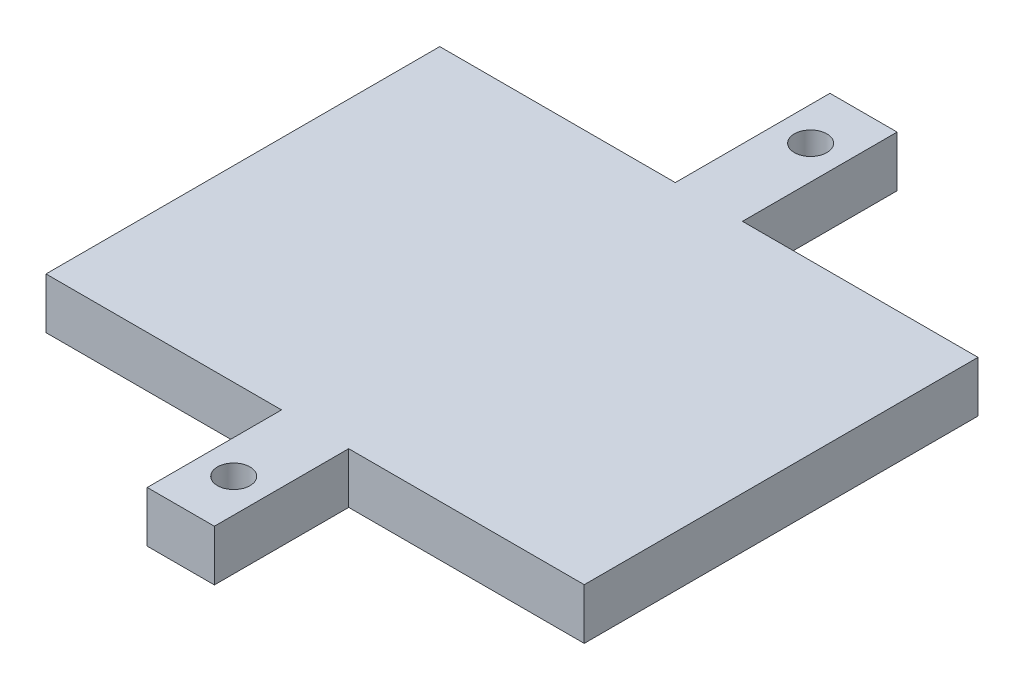
ISO-10303-21;
HEADER;
FILE_DESCRIPTION(('STEP AP214'),'2;1');
FILE_NAME('part.step','',(''),(''),'','','');
FILE_SCHEMA(('AUTOMOTIVE_DESIGN { 1 0 10303 214 1 1 1 1 }'));
ENDSEC;
DATA;
#1=APPLICATION_CONTEXT('core data for automotive mechanical design processes');
#2=APPLICATION_PROTOCOL_DEFINITION('international standard','automotive_design',2000,#1);
#3=PRODUCT_CONTEXT('',#1,'mechanical');
#4=PRODUCT('Part','Part','',(#3));
#5=PRODUCT_RELATED_PRODUCT_CATEGORY('part','',(#4));
#6=PRODUCT_DEFINITION_FORMATION('','',#4);
#7=PRODUCT_DEFINITION_CONTEXT('part definition',#1,'design');
#8=PRODUCT_DEFINITION('design','',#6,#7);
#9=PRODUCT_DEFINITION_SHAPE('','',#8);
#10=(LENGTH_UNIT() NAMED_UNIT(*) SI_UNIT(.MILLI.,.METRE.));
#11=(NAMED_UNIT(*) PLANE_ANGLE_UNIT() SI_UNIT($,.RADIAN.));
#12=(NAMED_UNIT(*) SI_UNIT($,.STERADIAN.) SOLID_ANGLE_UNIT());
#13=UNCERTAINTY_MEASURE_WITH_UNIT(LENGTH_MEASURE(1.E-05),#10,'distance_accuracy_value','');
#14=(GEOMETRIC_REPRESENTATION_CONTEXT(3) GLOBAL_UNCERTAINTY_ASSIGNED_CONTEXT((#13)) GLOBAL_UNIT_ASSIGNED_CONTEXT((#10,
#11,#12)) REPRESENTATION_CONTEXT('',''));
#15=CARTESIAN_POINT('',(0.,0.,0.));
#16=DIRECTION('',(0.,0.,1.));
#17=DIRECTION('',(1.,0.,0.));
#18=AXIS2_PLACEMENT_3D('',#15,#16,#17);
#19=CARTESIAN_POINT('',(90.4205987327976,6.35,19.1512432865832));
#20=DIRECTION('',(1.,0.,0.));
#21=DIRECTION('',(0.,0.,-1.));
#22=AXIS2_PLACEMENT_3D('',#19,#20,#21);
#23=PLANE('',#22);
#24=DIRECTION('',(0.,0.,1.));
#25=VECTOR('',#24,1.);
#26=CARTESIAN_POINT('',(90.4205987327976,0.,19.1512432865832));
#27=LINE('',#26,#25);
#28=CARTESIAN_POINT('',(90.4205987327976,0.,-29.9977567134168));
#29=VERTEX_POINT('',#28);
#30=CARTESIAN_POINT('',(90.4205987327976,0.,19.1512432865832));
#31=VERTEX_POINT('',#30);
#32=EDGE_CURVE('E152',#29,#31,#27,.T.);
#33=ORIENTED_EDGE('',*,*,#32,.T.);
#34=DIRECTION('',(0.,-1.,0.));
#35=VECTOR('',#34,1.);
#36=CARTESIAN_POINT('',(90.4205987327976,6.35,19.1512432865832));
#37=LINE('',#36,#35);
#38=CARTESIAN_POINT('',(90.4205987327976,6.35,19.1512432865832));
#39=VERTEX_POINT('',#38);
#40=EDGE_CURVE('E11',#39,#31,#37,.T.);
#41=ORIENTED_EDGE('',*,*,#40,.F.);
#42=DIRECTION('',(0.,0.,1.));
#43=VECTOR('',#42,1.);
#44=CARTESIAN_POINT('',(90.4205987327976,6.35,19.1512432865832));
#45=LINE('',#44,#43);
#46=CARTESIAN_POINT('',(90.4205987327976,6.35,-29.9977567134168));
#47=VERTEX_POINT('',#46);
#48=EDGE_CURVE('E175',#47,#39,#45,.T.);
#49=ORIENTED_EDGE('',*,*,#48,.F.);
#50=DIRECTION('',(0.,-1.,0.));
#51=VECTOR('',#50,1.);
#52=CARTESIAN_POINT('',(90.4205987327976,6.35,-29.9977567134168));
#53=LINE('',#52,#51);
#54=EDGE_CURVE('E148',#47,#29,#53,.T.);
#55=ORIENTED_EDGE('',*,*,#54,.T.);
#56=EDGE_LOOP('',(#33,#41,#49,#55));
#57=FACE_BOUND('',#56,.T.);
#58=ADVANCED_FACE('F32',(#57),#23,.F.);
#59=CARTESIAN_POINT('',(119.821098732798,6.35,19.1512432865832));
#60=DIRECTION('',(0.,0.,-1.));
#61=DIRECTION('',(-1.,0.,0.));
#62=AXIS2_PLACEMENT_3D('',#59,#60,#61);
#63=PLANE('',#62);
#64=DIRECTION('',(1.,0.,0.));
#65=VECTOR('',#64,1.);
#66=CARTESIAN_POINT('',(119.821098732798,0.,19.1512432865832));
#67=LINE('',#66,#65);
#68=CARTESIAN_POINT('',(119.821098732798,0.,19.1512432865832));
#69=VERTEX_POINT('',#68);
#70=EDGE_CURVE('E155',#31,#69,#67,.T.);
#71=ORIENTED_EDGE('',*,*,#70,.T.);
#72=DIRECTION('',(0.,-1.,0.));
#73=VECTOR('',#72,1.);
#74=CARTESIAN_POINT('',(119.821098732798,6.35,19.1512432865832));
#75=LINE('',#74,#73);
#76=CARTESIAN_POINT('',(119.821098732798,6.35,19.1512432865832));
#77=VERTEX_POINT('',#76);
#78=EDGE_CURVE('E40',#77,#69,#75,.T.);
#79=ORIENTED_EDGE('',*,*,#78,.F.);
#80=DIRECTION('',(1.,0.,0.));
#81=VECTOR('',#80,1.);
#82=CARTESIAN_POINT('',(119.821098732798,6.35,19.1512432865832));
#83=LINE('',#82,#81);
#84=EDGE_CURVE('E103',#39,#77,#83,.T.);
#85=ORIENTED_EDGE('',*,*,#84,.F.);
#86=ORIENTED_EDGE('',*,*,#40,.T.);
#87=EDGE_LOOP('',(#71,#79,#85,#86));
#88=FACE_BOUND('',#87,.T.);
#89=ADVANCED_FACE('F255',(#88),#63,.F.);
#90=CARTESIAN_POINT('',(119.821098732798,6.35,35.9152432865832));
#91=DIRECTION('',(1.,0.,0.));
#92=DIRECTION('',(0.,0.,-1.));
#93=AXIS2_PLACEMENT_3D('',#90,#91,#92);
#94=PLANE('',#93);
#95=DIRECTION('',(0.,0.,1.));
#96=VECTOR('',#95,1.);
#97=CARTESIAN_POINT('',(119.821098732798,0.,35.9152432865832));
#98=LINE('',#97,#96);
#99=CARTESIAN_POINT('',(119.821098732798,0.,35.9152432865832));
#100=VERTEX_POINT('',#99);
#101=EDGE_CURVE('E158',#69,#100,#98,.T.);
#102=ORIENTED_EDGE('',*,*,#101,.T.);
#103=DIRECTION('',(0.,-1.,0.));
#104=VECTOR('',#103,1.);
#105=CARTESIAN_POINT('',(119.821098732798,6.35,35.9152432865832));
#106=LINE('',#105,#104);
#107=CARTESIAN_POINT('',(119.821098732798,6.35,35.9152432865832));
#108=VERTEX_POINT('',#107);
#109=EDGE_CURVE('E194',#108,#100,#106,.T.);
#110=ORIENTED_EDGE('',*,*,#109,.F.);
#111=DIRECTION('',(0.,0.,1.));
#112=VECTOR('',#111,1.);
#113=CARTESIAN_POINT('',(119.821098732798,6.35,35.9152432865832));
#114=LINE('',#113,#112);
#115=EDGE_CURVE('E202',#77,#108,#114,.T.);
#116=ORIENTED_EDGE('',*,*,#115,.F.);
#117=ORIENTED_EDGE('',*,*,#78,.T.);
#118=EDGE_LOOP('',(#102,#110,#116,#117));
#119=FACE_BOUND('',#118,.T.);
#120=ADVANCED_FACE('F200',(#119),#94,.F.);
#121=CARTESIAN_POINT('',(128.203098732798,6.35,35.9152432865832));
#122=DIRECTION('',(0.,0.,-1.));
#123=DIRECTION('',(-1.,0.,0.));
#124=AXIS2_PLACEMENT_3D('',#121,#122,#123);
#125=PLANE('',#124);
#126=DIRECTION('',(1.,0.,0.));
#127=VECTOR('',#126,1.);
#128=CARTESIAN_POINT('',(128.203098732798,0.,35.9152432865832));
#129=LINE('',#128,#127);
#130=CARTESIAN_POINT('',(128.203098732798,0.,35.9152432865832));
#131=VERTEX_POINT('',#130);
#132=EDGE_CURVE('E160',#100,#131,#129,.T.);
#133=ORIENTED_EDGE('',*,*,#132,.T.);
#134=DIRECTION('',(0.,-1.,0.));
#135=VECTOR('',#134,1.);
#136=CARTESIAN_POINT('',(128.203098732798,6.35,35.9152432865832));
#137=LINE('',#136,#135);
#138=CARTESIAN_POINT('',(128.203098732798,6.35,35.9152432865832));
#139=VERTEX_POINT('',#138);
#140=EDGE_CURVE('E191',#139,#131,#137,.T.);
#141=ORIENTED_EDGE('',*,*,#140,.F.);
#142=DIRECTION('',(1.,0.,0.));
#143=VECTOR('',#142,1.);
#144=CARTESIAN_POINT('',(128.203098732798,6.35,35.9152432865832));
#145=LINE('',#144,#143);
#146=EDGE_CURVE('E220',#108,#139,#145,.T.);
#147=ORIENTED_EDGE('',*,*,#146,.F.);
#148=ORIENTED_EDGE('',*,*,#109,.T.);
#149=EDGE_LOOP('',(#133,#141,#147,#148));
#150=FACE_BOUND('',#149,.T.);
#151=ADVANCED_FACE('F211',(#150),#125,.F.);
#152=CARTESIAN_POINT('',(128.203098732798,6.35,19.1512432865832));
#153=DIRECTION('',(-1.,0.,0.));
#154=DIRECTION('',(0.,0.,1.));
#155=AXIS2_PLACEMENT_3D('',#152,#153,#154);
#156=PLANE('',#155);
#157=DIRECTION('',(0.,0.,-1.));
#158=VECTOR('',#157,1.);
#159=CARTESIAN_POINT('',(128.203098732798,0.,19.1512432865832));
#160=LINE('',#159,#158);
#161=CARTESIAN_POINT('',(128.203098732798,0.,19.1512432865832));
#162=VERTEX_POINT('',#161);
#163=EDGE_CURVE('E162',#131,#162,#160,.T.);
#164=ORIENTED_EDGE('',*,*,#163,.T.);
#165=DIRECTION('',(0.,-1.,0.));
#166=VECTOR('',#165,1.);
#167=CARTESIAN_POINT('',(128.203098732798,6.35,19.1512432865832));
#168=LINE('',#167,#166);
#169=CARTESIAN_POINT('',(128.203098732798,6.35,19.1512432865832));
#170=VERTEX_POINT('',#169);
#171=EDGE_CURVE('E188',#170,#162,#168,.T.);
#172=ORIENTED_EDGE('',*,*,#171,.F.);
#173=DIRECTION('',(0.,0.,-1.));
#174=VECTOR('',#173,1.);
#175=CARTESIAN_POINT('',(128.203098732798,6.35,19.1512432865832));
#176=LINE('',#175,#174);
#177=EDGE_CURVE('E217',#139,#170,#176,.T.);
#178=ORIENTED_EDGE('',*,*,#177,.F.);
#179=ORIENTED_EDGE('',*,*,#140,.T.);
#180=EDGE_LOOP('',(#164,#172,#178,#179));
#181=FACE_BOUND('',#180,.T.);
#182=ADVANCED_FACE('F215',(#181),#156,.F.);
#183=CARTESIAN_POINT('',(157.603598732798,6.35,19.1512432865832));
#184=DIRECTION('',(0.,0.,-1.));
#185=DIRECTION('',(-1.,0.,0.));
#186=AXIS2_PLACEMENT_3D('',#183,#184,#185);
#187=PLANE('',#186);
#188=DIRECTION('',(1.,0.,0.));
#189=VECTOR('',#188,1.);
#190=CARTESIAN_POINT('',(157.603598732798,0.,19.1512432865832));
#191=LINE('',#190,#189);
#192=CARTESIAN_POINT('',(157.603598732798,0.,19.1512432865832));
#193=VERTEX_POINT('',#192);
#194=EDGE_CURVE('E164',#162,#193,#191,.T.);
#195=ORIENTED_EDGE('',*,*,#194,.T.);
#196=DIRECTION('',(0.,-1.,0.));
#197=VECTOR('',#196,1.);
#198=CARTESIAN_POINT('',(157.603598732798,6.35,19.1512432865832));
#199=LINE('',#198,#197);
#200=CARTESIAN_POINT('',(157.603598732798,6.35,19.1512432865832));
#201=VERTEX_POINT('',#200);
#202=EDGE_CURVE('E185',#201,#193,#199,.T.);
#203=ORIENTED_EDGE('',*,*,#202,.F.);
#204=DIRECTION('',(1.,0.,0.));
#205=VECTOR('',#204,1.);
#206=CARTESIAN_POINT('',(157.603598732798,6.35,19.1512432865832));
#207=LINE('',#206,#205);
#208=EDGE_CURVE('E219',#170,#201,#207,.T.);
#209=ORIENTED_EDGE('',*,*,#208,.F.);
#210=ORIENTED_EDGE('',*,*,#171,.T.);
#211=EDGE_LOOP('',(#195,#203,#209,#210));
#212=FACE_BOUND('',#211,.T.);
#213=ADVANCED_FACE('F268',(#212),#187,.F.);
#214=CARTESIAN_POINT('',(157.603598732798,6.35,-29.9977567134168));
#215=DIRECTION('',(-1.,0.,0.));
#216=DIRECTION('',(0.,0.,1.));
#217=AXIS2_PLACEMENT_3D('',#214,#215,#216);
#218=PLANE('',#217);
#219=DIRECTION('',(0.,0.,-1.));
#220=VECTOR('',#219,1.);
#221=CARTESIAN_POINT('',(157.603598732798,0.,-29.9977567134168));
#222=LINE('',#221,#220);
#223=CARTESIAN_POINT('',(157.603598732798,0.,-29.9977567134168));
#224=VERTEX_POINT('',#223);
#225=EDGE_CURVE('E166',#193,#224,#222,.T.);
#226=ORIENTED_EDGE('',*,*,#225,.T.);
#227=DIRECTION('',(0.,-1.,0.));
#228=VECTOR('',#227,1.);
#229=CARTESIAN_POINT('',(157.603598732798,6.35,-29.9977567134168));
#230=LINE('',#229,#228);
#231=CARTESIAN_POINT('',(157.603598732798,6.35,-29.9977567134168));
#232=VERTEX_POINT('',#231);
#233=EDGE_CURVE('E182',#232,#224,#230,.T.);
#234=ORIENTED_EDGE('',*,*,#233,.F.);
#235=DIRECTION('',(0.,0.,-1.));
#236=VECTOR('',#235,1.);
#237=CARTESIAN_POINT('',(157.603598732798,6.35,-29.9977567134168));
#238=LINE('',#237,#236);
#239=EDGE_CURVE('E222',#201,#232,#238,.T.);
#240=ORIENTED_EDGE('',*,*,#239,.F.);
#241=ORIENTED_EDGE('',*,*,#202,.T.);
#242=EDGE_LOOP('',(#226,#234,#240,#241));
#243=FACE_BOUND('',#242,.T.);
#244=ADVANCED_FACE('F271',(#243),#218,.F.);
#245=CARTESIAN_POINT('',(128.203098732798,6.35,-29.9977567134168));
#246=DIRECTION('',(0.,0.,1.));
#247=DIRECTION('',(1.,0.,0.));
#248=AXIS2_PLACEMENT_3D('',#245,#246,#247);
#249=PLANE('',#248);
#250=DIRECTION('',(-1.,0.,0.));
#251=VECTOR('',#250,1.);
#252=CARTESIAN_POINT('',(128.203098732798,0.,-29.9977567134168));
#253=LINE('',#252,#251);
#254=CARTESIAN_POINT('',(128.203098732798,0.,-29.9977567134168));
#255=VERTEX_POINT('',#254);
#256=EDGE_CURVE('E168',#224,#255,#253,.T.);
#257=ORIENTED_EDGE('',*,*,#256,.T.);
#258=DIRECTION('',(0.,-1.,0.));
#259=VECTOR('',#258,1.);
#260=CARTESIAN_POINT('',(128.203098732798,6.35,-29.9977567134168));
#261=LINE('',#260,#259);
#262=CARTESIAN_POINT('',(128.203098732798,6.35,-29.9977567134168));
#263=VERTEX_POINT('',#262);
#264=EDGE_CURVE('E179',#263,#255,#261,.T.);
#265=ORIENTED_EDGE('',*,*,#264,.F.);
#266=DIRECTION('',(-1.,0.,0.));
#267=VECTOR('',#266,1.);
#268=CARTESIAN_POINT('',(128.203098732798,6.35,-29.9977567134168));
#269=LINE('',#268,#267);
#270=EDGE_CURVE('E228',#232,#263,#269,.T.);
#271=ORIENTED_EDGE('',*,*,#270,.F.);
#272=ORIENTED_EDGE('',*,*,#233,.T.);
#273=EDGE_LOOP('',(#257,#265,#271,#272));
#274=FACE_BOUND('',#273,.T.);
#275=ADVANCED_FACE('F234',(#274),#249,.F.);
#276=CARTESIAN_POINT('',(128.203098732798,6.35,-49.3017567134168));
#277=DIRECTION('',(-1.,0.,0.));
#278=DIRECTION('',(0.,0.,1.));
#279=AXIS2_PLACEMENT_3D('',#276,#277,#278);
#280=PLANE('',#279);
#281=DIRECTION('',(0.,0.,-1.));
#282=VECTOR('',#281,1.);
#283=CARTESIAN_POINT('',(128.203098732798,0.,-49.3017567134168));
#284=LINE('',#283,#282);
#285=CARTESIAN_POINT('',(128.203098732798,0.,-49.3017567134168));
#286=VERTEX_POINT('',#285);
#287=EDGE_CURVE('E170',#255,#286,#284,.T.);
#288=ORIENTED_EDGE('',*,*,#287,.T.);
#289=DIRECTION('',(0.,-1.,0.));
#290=VECTOR('',#289,1.);
#291=CARTESIAN_POINT('',(128.203098732798,6.35,-49.3017567134168));
#292=LINE('',#291,#290);
#293=CARTESIAN_POINT('',(128.203098732798,6.35,-49.3017567134168));
#294=VERTEX_POINT('',#293);
#295=EDGE_CURVE('E143',#294,#286,#292,.T.);
#296=ORIENTED_EDGE('',*,*,#295,.F.);
#297=DIRECTION('',(0.,0.,-1.));
#298=VECTOR('',#297,1.);
#299=CARTESIAN_POINT('',(128.203098732798,6.35,-49.3017567134168));
#300=LINE('',#299,#298);
#301=EDGE_CURVE('E134',#263,#294,#300,.T.);
#302=ORIENTED_EDGE('',*,*,#301,.F.);
#303=ORIENTED_EDGE('',*,*,#264,.T.);
#304=EDGE_LOOP('',(#288,#296,#302,#303));
#305=FACE_BOUND('',#304,.T.);
#306=ADVANCED_FACE('F238',(#305),#280,.F.);
#307=CARTESIAN_POINT('',(119.821098732798,6.35,-49.3017567134168));
#308=DIRECTION('',(0.,0.,1.));
#309=DIRECTION('',(1.,0.,0.));
#310=AXIS2_PLACEMENT_3D('',#307,#308,#309);
#311=PLANE('',#310);
#312=DIRECTION('',(-1.,0.,0.));
#313=VECTOR('',#312,1.);
#314=CARTESIAN_POINT('',(119.821098732798,0.,-49.3017567134168));
#315=LINE('',#314,#313);
#316=CARTESIAN_POINT('',(119.821098732798,0.,-49.3017567134168));
#317=VERTEX_POINT('',#316);
#318=EDGE_CURVE('E142',#286,#317,#315,.T.);
#319=ORIENTED_EDGE('',*,*,#318,.T.);
#320=DIRECTION('',(0.,-1.,0.));
#321=VECTOR('',#320,1.);
#322=CARTESIAN_POINT('',(119.821098732798,6.35,-49.3017567134168));
#323=LINE('',#322,#321);
#324=CARTESIAN_POINT('',(119.821098732798,6.35,-49.3017567134168));
#325=VERTEX_POINT('',#324);
#326=EDGE_CURVE('E139',#325,#317,#323,.T.);
#327=ORIENTED_EDGE('',*,*,#326,.F.);
#328=DIRECTION('',(-1.,0.,0.));
#329=VECTOR('',#328,1.);
#330=CARTESIAN_POINT('',(119.821098732798,6.35,-49.3017567134168));
#331=LINE('',#330,#329);
#332=EDGE_CURVE('E128',#294,#325,#331,.T.);
#333=ORIENTED_EDGE('',*,*,#332,.F.);
#334=ORIENTED_EDGE('',*,*,#295,.T.);
#335=EDGE_LOOP('',(#319,#327,#333,#334));
#336=FACE_BOUND('',#335,.T.);
#337=ADVANCED_FACE('F140',(#336),#311,.F.);
#338=CARTESIAN_POINT('',(119.821098732798,6.35,-29.9977567134168));
#339=DIRECTION('',(1.,0.,0.));
#340=DIRECTION('',(0.,0.,-1.));
#341=AXIS2_PLACEMENT_3D('',#338,#339,#340);
#342=PLANE('',#341);
#343=DIRECTION('',(0.,0.,1.));
#344=VECTOR('',#343,1.);
#345=CARTESIAN_POINT('',(119.821098732798,0.,-29.9977567134168));
#346=LINE('',#345,#344);
#347=CARTESIAN_POINT('',(119.821098732798,0.,-29.9977567134168));
#348=VERTEX_POINT('',#347);
#349=EDGE_CURVE('E89',#317,#348,#346,.T.);
#350=ORIENTED_EDGE('',*,*,#349,.T.);
#351=DIRECTION('',(0.,-1.,0.));
#352=VECTOR('',#351,1.);
#353=CARTESIAN_POINT('',(119.821098732798,6.35,-29.9977567134168));
#354=LINE('',#353,#352);
#355=CARTESIAN_POINT('',(119.821098732798,6.35,-29.9977567134168));
#356=VERTEX_POINT('',#355);
#357=EDGE_CURVE('E144',#356,#348,#354,.T.);
#358=ORIENTED_EDGE('',*,*,#357,.F.);
#359=DIRECTION('',(0.,0.,1.));
#360=VECTOR('',#359,1.);
#361=CARTESIAN_POINT('',(119.821098732798,6.35,-29.9977567134168));
#362=LINE('',#361,#360);
#363=EDGE_CURVE('E132',#325,#356,#362,.T.);
#364=ORIENTED_EDGE('',*,*,#363,.F.);
#365=ORIENTED_EDGE('',*,*,#326,.T.);
#366=EDGE_LOOP('',(#350,#358,#364,#365));
#367=FACE_BOUND('',#366,.T.);
#368=ADVANCED_FACE('F146',(#367),#342,.F.);
#369=CARTESIAN_POINT('',(90.4205987327976,6.35,-29.9977567134168));
#370=DIRECTION('',(0.,0.,1.));
#371=DIRECTION('',(1.,0.,0.));
#372=AXIS2_PLACEMENT_3D('',#369,#370,#371);
#373=PLANE('',#372);
#374=DIRECTION('',(-1.,0.,0.));
#375=VECTOR('',#374,1.);
#376=CARTESIAN_POINT('',(90.4205987327976,0.,-29.9977567134168));
#377=LINE('',#376,#375);
#378=EDGE_CURVE('E95',#348,#29,#377,.T.);
#379=ORIENTED_EDGE('',*,*,#378,.T.);
#380=ORIENTED_EDGE('',*,*,#54,.F.);
#381=DIRECTION('',(-1.,0.,0.));
#382=VECTOR('',#381,1.);
#383=CARTESIAN_POINT('',(90.4205987327976,6.35,-29.9977567134168));
#384=LINE('',#383,#382);
#385=EDGE_CURVE('E48',#356,#47,#384,.T.);
#386=ORIENTED_EDGE('',*,*,#385,.F.);
#387=ORIENTED_EDGE('',*,*,#357,.T.);
#388=EDGE_LOOP('',(#379,#380,#386,#387));
#389=FACE_BOUND('',#388,.T.);
#390=ADVANCED_FACE('F242',(#389),#373,.F.);
#391=CARTESIAN_POINT('',(0.,6.35,0.));
#392=DIRECTION('',(0.,-1.,0.));
#393=DIRECTION('',(0.,0.,-1.));
#394=AXIS2_PLACEMENT_3D('',#391,#392,#393);
#395=PLANE('',#394);
#396=CARTESIAN_POINT('',(124.012098732798,6.35,-42.6977567134168));
#397=DIRECTION('',(0.,1.,0.));
#398=DIRECTION('',(0.,0.,1.));
#399=AXIS2_PLACEMENT_3D('',#396,#397,#398);
#400=CIRCLE('',#399,2.03200000000001);
#401=CARTESIAN_POINT('',(124.012098732798,6.35,-40.6657567134168));
#402=VERTEX_POINT('',#401);
#403=EDGE_CURVE('E332',#402,#402,#400,.T.);
#404=ORIENTED_EDGE('',*,*,#403,.F.);
#405=EDGE_LOOP('',(#404));
#406=FACE_BOUND('',#405,.T.);
#407=CARTESIAN_POINT('',(124.012098732798,6.35,29.3112432865832));
#408=DIRECTION('',(0.,1.,0.));
#409=DIRECTION('',(0.,0.,1.));
#410=AXIS2_PLACEMENT_3D('',#407,#408,#409);
#411=CIRCLE('',#410,2.03200000000001);
#412=CARTESIAN_POINT('',(124.012098732798,6.35,31.3432432865832));
#413=VERTEX_POINT('',#412);
#414=EDGE_CURVE('E334',#413,#413,#411,.T.);
#415=ORIENTED_EDGE('',*,*,#414,.F.);
#416=EDGE_LOOP('',(#415));
#417=FACE_BOUND('',#416,.T.);
#418=ORIENTED_EDGE('',*,*,#48,.T.);
#419=ORIENTED_EDGE('',*,*,#84,.T.);
#420=ORIENTED_EDGE('',*,*,#115,.T.);
#421=ORIENTED_EDGE('',*,*,#146,.T.);
#422=ORIENTED_EDGE('',*,*,#177,.T.);
#423=ORIENTED_EDGE('',*,*,#208,.T.);
#424=ORIENTED_EDGE('',*,*,#239,.T.);
#425=ORIENTED_EDGE('',*,*,#270,.T.);
#426=ORIENTED_EDGE('',*,*,#301,.T.);
#427=ORIENTED_EDGE('',*,*,#332,.T.);
#428=ORIENTED_EDGE('',*,*,#363,.T.);
#429=ORIENTED_EDGE('',*,*,#385,.T.);
#430=EDGE_LOOP('',(#418,#419,#420,#421,#422,#423,#424,#425,#426,#427,#428,#429));
#431=FACE_BOUND('',#430,.T.);
#432=ADVANCED_FACE('F130',(#406,#417,#431),#395,.F.);
#433=CARTESIAN_POINT('',(0.,0.,0.));
#434=DIRECTION('',(0.,-1.,0.));
#435=DIRECTION('',(0.,0.,-1.));
#436=AXIS2_PLACEMENT_3D('',#433,#434,#435);
#437=PLANE('',#436);
#438=CARTESIAN_POINT('',(124.012098732798,0.,-42.6977567134168));
#439=DIRECTION('',(0.,1.,0.));
#440=DIRECTION('',(0.,0.,1.));
#441=AXIS2_PLACEMENT_3D('',#438,#439,#440);
#442=CIRCLE('',#441,2.03200000000001);
#443=CARTESIAN_POINT('',(124.012098732798,0.,-40.6657567134168));
#444=VERTEX_POINT('',#443);
#445=EDGE_CURVE('E329',#444,#444,#442,.T.);
#446=ORIENTED_EDGE('',*,*,#445,.T.);
#447=EDGE_LOOP('',(#446));
#448=FACE_BOUND('',#447,.T.);
#449=CARTESIAN_POINT('',(124.012098732798,0.,29.3112432865832));
#450=DIRECTION('',(0.,1.,0.));
#451=DIRECTION('',(0.,0.,1.));
#452=AXIS2_PLACEMENT_3D('',#449,#450,#451);
#453=CIRCLE('',#452,2.03200000000001);
#454=CARTESIAN_POINT('',(124.012098732798,0.,31.3432432865832));
#455=VERTEX_POINT('',#454);
#456=EDGE_CURVE('E156',#455,#455,#453,.T.);
#457=ORIENTED_EDGE('',*,*,#456,.T.);
#458=EDGE_LOOP('',(#457));
#459=FACE_BOUND('',#458,.T.);
#460=ORIENTED_EDGE('',*,*,#32,.F.);
#461=ORIENTED_EDGE('',*,*,#378,.F.);
#462=ORIENTED_EDGE('',*,*,#349,.F.);
#463=ORIENTED_EDGE('',*,*,#318,.F.);
#464=ORIENTED_EDGE('',*,*,#287,.F.);
#465=ORIENTED_EDGE('',*,*,#256,.F.);
#466=ORIENTED_EDGE('',*,*,#225,.F.);
#467=ORIENTED_EDGE('',*,*,#194,.F.);
#468=ORIENTED_EDGE('',*,*,#163,.F.);
#469=ORIENTED_EDGE('',*,*,#132,.F.);
#470=ORIENTED_EDGE('',*,*,#101,.F.);
#471=ORIENTED_EDGE('',*,*,#70,.F.);
#472=EDGE_LOOP('',(#460,#461,#462,#463,#464,#465,#466,#467,#468,#469,#470,#471));
#473=FACE_BOUND('',#472,.T.);
#474=ADVANCED_FACE('F206',(#448,#459,#473),#437,.T.);
#475=CARTESIAN_POINT('',(124.012098732798,0.,29.3112432865832));
#476=DIRECTION('',(0.,1.,0.));
#477=DIRECTION('',(0.,0.,1.));
#478=AXIS2_PLACEMENT_3D('',#475,#476,#477);
#479=CYLINDRICAL_SURFACE('',#478,2.03200000000001);
#480=ORIENTED_EDGE('',*,*,#456,.F.);
#481=EDGE_LOOP('',(#480));
#482=FACE_BOUND('',#481,.T.);
#483=ORIENTED_EDGE('',*,*,#414,.T.);
#484=EDGE_LOOP('',(#483));
#485=FACE_BOUND('',#484,.T.);
#486=ADVANCED_FACE('F304',(#482,#485),#479,.F.);
#487=CARTESIAN_POINT('',(124.012098732798,0.,-42.6977567134168));
#488=DIRECTION('',(0.,1.,0.));
#489=DIRECTION('',(0.,0.,1.));
#490=AXIS2_PLACEMENT_3D('',#487,#488,#489);
#491=CYLINDRICAL_SURFACE('',#490,2.03200000000001);
#492=ORIENTED_EDGE('',*,*,#445,.F.);
#493=EDGE_LOOP('',(#492));
#494=FACE_BOUND('',#493,.T.);
#495=ORIENTED_EDGE('',*,*,#403,.T.);
#496=EDGE_LOOP('',(#495));
#497=FACE_BOUND('',#496,.T.);
#498=ADVANCED_FACE('F312',(#494,#497),#491,.F.);
#499=CLOSED_SHELL('',(#58,#89,#120,#151,#182,#213,#244,#275,#306,#337,#368,#390,#432,#474,#486,#498));
#500=MANIFOLD_SOLID_BREP('B2',#499);
#501=ADVANCED_BREP_SHAPE_REPRESENTATION('',(#18,#500),#14);
#502=SHAPE_DEFINITION_REPRESENTATION(#9,#501);
ENDSEC;
END-ISO-10303-21;
